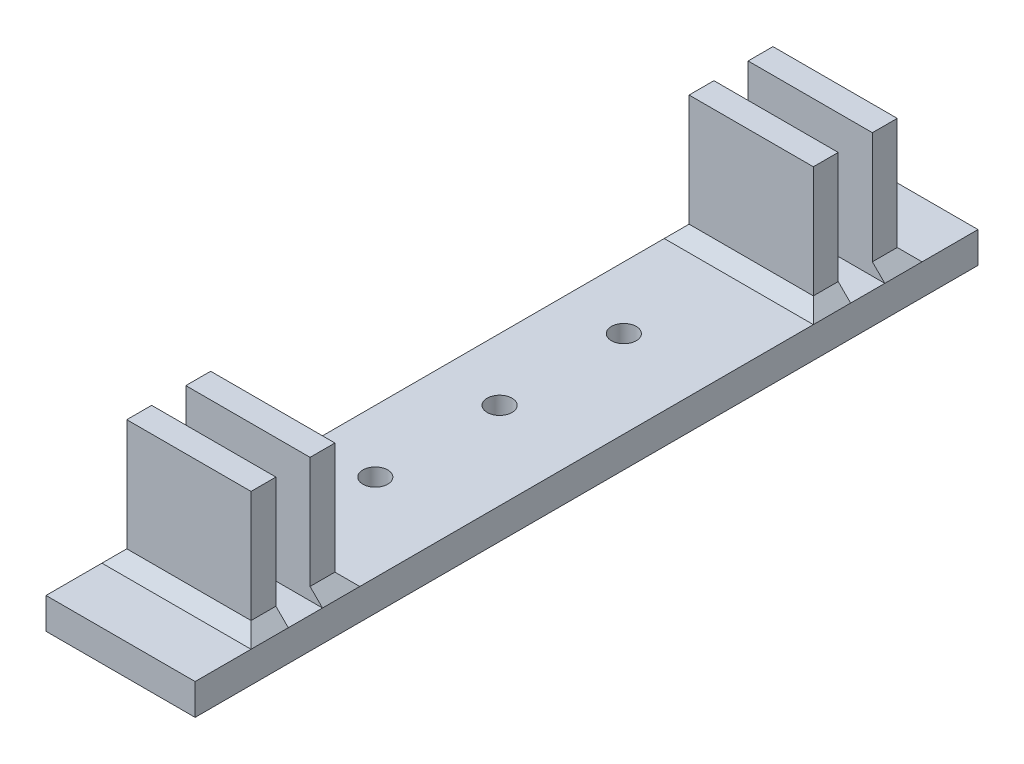
ISO-10303-21;
HEADER;
FILE_DESCRIPTION(('STEP AP214'),'2;1');
FILE_NAME('part.step','',(''),(''),'','','');
FILE_SCHEMA(('AUTOMOTIVE_DESIGN { 1 0 10303 214 1 1 1 1 }'));
ENDSEC;
DATA;
#1=APPLICATION_CONTEXT('core data for automotive mechanical design processes');
#2=APPLICATION_PROTOCOL_DEFINITION('international standard','automotive_design',2000,#1);
#3=PRODUCT_CONTEXT('',#1,'mechanical');
#4=PRODUCT('Part','Part','',(#3));
#5=PRODUCT_RELATED_PRODUCT_CATEGORY('part','',(#4));
#6=PRODUCT_DEFINITION_FORMATION('','',#4);
#7=PRODUCT_DEFINITION_CONTEXT('part definition',#1,'design');
#8=PRODUCT_DEFINITION('design','',#6,#7);
#9=PRODUCT_DEFINITION_SHAPE('','',#8);
#10=(LENGTH_UNIT() NAMED_UNIT(*) SI_UNIT(.MILLI.,.METRE.));
#11=(NAMED_UNIT(*) PLANE_ANGLE_UNIT() SI_UNIT($,.RADIAN.));
#12=(NAMED_UNIT(*) SI_UNIT($,.STERADIAN.) SOLID_ANGLE_UNIT());
#13=UNCERTAINTY_MEASURE_WITH_UNIT(LENGTH_MEASURE(1.E-05),#10,'distance_accuracy_value','');
#14=(GEOMETRIC_REPRESENTATION_CONTEXT(3) GLOBAL_UNCERTAINTY_ASSIGNED_CONTEXT((#13)) GLOBAL_UNIT_ASSIGNED_CONTEXT((#10,
#11,#12)) REPRESENTATION_CONTEXT('',''));
#15=CARTESIAN_POINT('',(0.,0.,0.));
#16=DIRECTION('',(0.,0.,1.));
#17=DIRECTION('',(1.,0.,0.));
#18=AXIS2_PLACEMENT_3D('',#15,#16,#17);
#19=CARTESIAN_POINT('',(0.,5.,0.));
#20=DIRECTION('',(0.,1.,0.));
#21=DIRECTION('',(0.,0.,1.));
#22=AXIS2_PLACEMENT_3D('',#19,#20,#21);
#23=PLANE('',#22);
#24=DIRECTION('',(1.,0.,0.));
#25=VECTOR('',#24,1.);
#26=CARTESIAN_POINT('',(-72.6508875739645,5.,74.8491124260355));
#27=LINE('',#26,#25);
#28=CARTESIAN_POINT('',(-74.6508875739645,5.,74.8491124260355));
#29=VERTEX_POINT('',#28);
#30=CARTESIAN_POINT('',(-50.6508875739645,5.,74.8491124260355));
#31=VERTEX_POINT('',#30);
#32=EDGE_CURVE('E243',#29,#31,#27,.T.);
#33=ORIENTED_EDGE('',*,*,#32,.F.);
#34=DIRECTION('',(0.,0.,1.));
#35=VECTOR('',#34,1.);
#36=CARTESIAN_POINT('',(-74.6508875739645,5.,-30.6508875739645));
#37=LINE('',#36,#35);
#38=CARTESIAN_POINT('',(-74.6508875739645,5.,80.3491124260355));
#39=VERTEX_POINT('',#38);
#40=EDGE_CURVE('E547',#29,#39,#37,.T.);
#41=ORIENTED_EDGE('',*,*,#40,.T.);
#42=DIRECTION('',(-1.,0.,0.));
#43=VECTOR('',#42,1.);
#44=CARTESIAN_POINT('',(-52.6508875739645,5.,80.3491124260355));
#45=LINE('',#44,#43);
#46=CARTESIAN_POINT('',(-50.6508875739645,5.,80.3491124260355));
#47=VERTEX_POINT('',#46);
#48=EDGE_CURVE('E248',#47,#39,#45,.T.);
#49=ORIENTED_EDGE('',*,*,#48,.F.);
#50=DIRECTION('',(0.,0.,-1.));
#51=VECTOR('',#50,1.);
#52=CARTESIAN_POINT('',(-50.6508875739645,5.,-30.6508875739645));
#53=LINE('',#52,#51);
#54=EDGE_CURVE('E889',#47,#31,#53,.T.);
#55=ORIENTED_EDGE('',*,*,#54,.T.);
#56=EDGE_LOOP('',(#33,#41,#49,#55));
#57=FACE_BOUND('',#56,.T.);
#58=ADVANCED_FACE('F32',(#57),#23,.T.);
#59=CARTESIAN_POINT('',(-64.6508875739645,5.,32.3491124260355));
#60=DIRECTION('',(0.,1.,0.));
#61=DIRECTION('',(0.,0.,1.));
#62=AXIS2_PLACEMENT_3D('',#59,#60,#61);
#63=CIRCLE('',#62,2.);
#64=CARTESIAN_POINT('',(-64.6508875739645,5.,34.3491124260355));
#65=VERTEX_POINT('',#64);
#66=EDGE_CURVE('E910',#65,#65,#63,.T.);
#67=ORIENTED_EDGE('',*,*,#66,.F.);
#68=EDGE_LOOP('',(#67));
#69=FACE_BOUND('',#68,.T.);
#70=CARTESIAN_POINT('',(-64.6508875739645,5.,12.3491124260355));
#71=DIRECTION('',(0.,1.,0.));
#72=DIRECTION('',(0.,0.,1.));
#73=AXIS2_PLACEMENT_3D('',#70,#71,#72);
#74=CIRCLE('',#73,2.);
#75=CARTESIAN_POINT('',(-64.6508875739645,5.,14.3491124260355));
#76=VERTEX_POINT('',#75);
#77=EDGE_CURVE('E907',#76,#76,#74,.T.);
#78=ORIENTED_EDGE('',*,*,#77,.F.);
#79=EDGE_LOOP('',(#78));
#80=FACE_BOUND('',#79,.T.);
#81=CARTESIAN_POINT('',(-64.6508875739645,5.,52.3491124260355));
#82=DIRECTION('',(0.,1.,0.));
#83=DIRECTION('',(0.,0.,1.));
#84=AXIS2_PLACEMENT_3D('',#81,#82,#83);
#85=CIRCLE('',#84,1.99999999999999);
#86=CARTESIAN_POINT('',(-64.6508875739645,5.,54.3491124260355));
#87=VERTEX_POINT('',#86);
#88=EDGE_CURVE('E892',#87,#87,#85,.T.);
#89=ORIENTED_EDGE('',*,*,#88,.F.);
#90=EDGE_LOOP('',(#89));
#91=FACE_BOUND('',#90,.T.);
#92=CARTESIAN_POINT('',(-74.6508875739645,5.,-4.1508875739645));
#93=VERTEX_POINT('',#92);
#94=CARTESIAN_POINT('',(-74.6508875739645,5.,68.8491124260355));
#95=VERTEX_POINT('',#94);
#96=EDGE_CURVE('E881',#93,#95,#37,.T.);
#97=ORIENTED_EDGE('',*,*,#96,.T.);
#98=DIRECTION('',(1.,0.,0.));
#99=VECTOR('',#98,1.);
#100=CARTESIAN_POINT('',(0.,5.,68.8491124260355));
#101=LINE('',#100,#99);
#102=CARTESIAN_POINT('',(-50.6508875739645,5.,68.8491124260355));
#103=VERTEX_POINT('',#102);
#104=EDGE_CURVE('E362',#95,#103,#101,.T.);
#105=ORIENTED_EDGE('',*,*,#104,.T.);
#106=CARTESIAN_POINT('',(-50.6508875739645,5.,-4.1508875739645));
#107=VERTEX_POINT('',#106);
#108=EDGE_CURVE('E450',#103,#107,#53,.T.);
#109=ORIENTED_EDGE('',*,*,#108,.T.);
#110=DIRECTION('',(-1.,0.,0.));
#111=VECTOR('',#110,1.);
#112=CARTESIAN_POINT('',(0.,5.,-4.1508875739645));
#113=LINE('',#112,#111);
#114=EDGE_CURVE('E356',#107,#93,#113,.T.);
#115=ORIENTED_EDGE('',*,*,#114,.T.);
#116=EDGE_LOOP('',(#97,#105,#109,#115));
#117=FACE_BOUND('',#116,.T.);
#118=ADVANCED_FACE('F504',(#69,#80,#91,#117),#23,.T.);
#119=DIRECTION('',(1.,0.,0.));
#120=VECTOR('',#119,1.);
#121=CARTESIAN_POINT('',(-72.6508875739645,5.,-15.6508875739645));
#122=LINE('',#121,#120);
#123=CARTESIAN_POINT('',(-74.6508875739645,5.,-15.6508875739645));
#124=VERTEX_POINT('',#123);
#125=CARTESIAN_POINT('',(-50.6508875739645,5.,-15.6508875739645));
#126=VERTEX_POINT('',#125);
#127=EDGE_CURVE('E296',#124,#126,#122,.T.);
#128=ORIENTED_EDGE('',*,*,#127,.F.);
#129=CARTESIAN_POINT('',(-74.6508875739645,5.,-10.1508875739645));
#130=VERTEX_POINT('',#129);
#131=EDGE_CURVE('E873',#124,#130,#37,.T.);
#132=ORIENTED_EDGE('',*,*,#131,.T.);
#133=DIRECTION('',(-1.,0.,0.));
#134=VECTOR('',#133,1.);
#135=CARTESIAN_POINT('',(-72.6508875739645,5.,-10.1508875739645));
#136=LINE('',#135,#134);
#137=CARTESIAN_POINT('',(-50.6508875739645,5.,-10.1508875739645));
#138=VERTEX_POINT('',#137);
#139=EDGE_CURVE('E276',#138,#130,#136,.T.);
#140=ORIENTED_EDGE('',*,*,#139,.F.);
#141=EDGE_CURVE('E441',#138,#126,#53,.T.);
#142=ORIENTED_EDGE('',*,*,#141,.T.);
#143=EDGE_LOOP('',(#128,#132,#140,#142));
#144=FACE_BOUND('',#143,.T.);
#145=ADVANCED_FACE('F511',(#144),#23,.T.);
#146=CARTESIAN_POINT('',(-74.6508875739645,5.,-30.6508875739645));
#147=VERTEX_POINT('',#146);
#148=CARTESIAN_POINT('',(-74.6508875739645,5.,-21.6508875739645));
#149=VERTEX_POINT('',#148);
#150=EDGE_CURVE('E320',#147,#149,#37,.T.);
#151=ORIENTED_EDGE('',*,*,#150,.T.);
#152=DIRECTION('',(1.,0.,0.));
#153=VECTOR('',#152,1.);
#154=CARTESIAN_POINT('',(0.,5.,-21.6508875739645));
#155=LINE('',#154,#153);
#156=CARTESIAN_POINT('',(-50.6508875739645,5.,-21.6508875739645));
#157=VERTEX_POINT('',#156);
#158=EDGE_CURVE('E358',#149,#157,#155,.T.);
#159=ORIENTED_EDGE('',*,*,#158,.T.);
#160=CARTESIAN_POINT('',(-50.6508875739645,5.,-30.6508875739645));
#161=VERTEX_POINT('',#160);
#162=EDGE_CURVE('E327',#157,#161,#53,.T.);
#163=ORIENTED_EDGE('',*,*,#162,.T.);
#164=DIRECTION('',(-1.,0.,0.));
#165=VECTOR('',#164,1.);
#166=CARTESIAN_POINT('',(-74.6508875739645,5.,-30.6508875739645));
#167=LINE('',#166,#165);
#168=EDGE_CURVE('E331',#161,#147,#167,.T.);
#169=ORIENTED_EDGE('',*,*,#168,.T.);
#170=EDGE_LOOP('',(#151,#159,#163,#169));
#171=FACE_BOUND('',#170,.T.);
#172=ADVANCED_FACE('F455',(#171),#23,.T.);
#173=CARTESIAN_POINT('',(-50.6508875739645,5.,95.3491124260355));
#174=VERTEX_POINT('',#173);
#175=CARTESIAN_POINT('',(-50.6508875739645,5.,86.3491124260355));
#176=VERTEX_POINT('',#175);
#177=EDGE_CURVE('E328',#174,#176,#53,.T.);
#178=ORIENTED_EDGE('',*,*,#177,.T.);
#179=DIRECTION('',(-1.,0.,0.));
#180=VECTOR('',#179,1.);
#181=CARTESIAN_POINT('',(0.,5.,86.3491124260355));
#182=LINE('',#181,#180);
#183=CARTESIAN_POINT('',(-74.6508875739645,5.,86.3491124260355));
#184=VERTEX_POINT('',#183);
#185=EDGE_CURVE('E360',#176,#184,#182,.T.);
#186=ORIENTED_EDGE('',*,*,#185,.T.);
#187=CARTESIAN_POINT('',(-74.6508875739645,5.,95.3491124260355));
#188=VERTEX_POINT('',#187);
#189=EDGE_CURVE('E325',#184,#188,#37,.T.);
#190=ORIENTED_EDGE('',*,*,#189,.T.);
#191=DIRECTION('',(1.,0.,0.));
#192=VECTOR('',#191,1.);
#193=CARTESIAN_POINT('',(-74.6508875739645,5.,95.3491124260355));
#194=LINE('',#193,#192);
#195=EDGE_CURVE('E323',#188,#174,#194,.T.);
#196=ORIENTED_EDGE('',*,*,#195,.T.);
#197=EDGE_LOOP('',(#178,#186,#190,#196));
#198=FACE_BOUND('',#197,.T.);
#199=ADVANCED_FACE('F507',(#198),#23,.T.);
#200=CARTESIAN_POINT('',(-74.6508875739645,5.,-30.6508875739645));
#201=DIRECTION('',(1.,0.,0.));
#202=DIRECTION('',(0.,0.,-1.));
#203=AXIS2_PLACEMENT_3D('',#200,#201,#202);
#204=PLANE('',#203);
#205=DIRECTION('',(0.,0.,1.));
#206=VECTOR('',#205,1.);
#207=CARTESIAN_POINT('',(-74.6508875739645,0.,-30.6508875739645));
#208=LINE('',#207,#206);
#209=CARTESIAN_POINT('',(-74.6508875739645,0.,-30.6508875739645));
#210=VERTEX_POINT('',#209);
#211=CARTESIAN_POINT('',(-74.6508875739645,0.,95.3491124260355));
#212=VERTEX_POINT('',#211);
#213=EDGE_CURVE('E319',#210,#212,#208,.T.);
#214=ORIENTED_EDGE('',*,*,#213,.T.);
#215=DIRECTION('',(0.,-1.,0.));
#216=VECTOR('',#215,1.);
#217=CARTESIAN_POINT('',(-74.6508875739645,5.,95.3491124260355));
#218=LINE('',#217,#216);
#219=EDGE_CURVE('E351',#188,#212,#218,.T.);
#220=ORIENTED_EDGE('',*,*,#219,.F.);
#221=ORIENTED_EDGE('',*,*,#189,.F.);
#222=EDGE_CURVE('E544',#39,#184,#37,.T.);
#223=ORIENTED_EDGE('',*,*,#222,.F.);
#224=ORIENTED_EDGE('',*,*,#40,.F.);
#225=EDGE_CURVE('E548',#95,#29,#37,.T.);
#226=ORIENTED_EDGE('',*,*,#225,.F.);
#227=ORIENTED_EDGE('',*,*,#96,.F.);
#228=EDGE_CURVE('E875',#130,#93,#37,.T.);
#229=ORIENTED_EDGE('',*,*,#228,.F.);
#230=ORIENTED_EDGE('',*,*,#131,.F.);
#231=EDGE_CURVE('E324',#149,#124,#37,.T.);
#232=ORIENTED_EDGE('',*,*,#231,.F.);
#233=ORIENTED_EDGE('',*,*,#150,.F.);
#234=DIRECTION('',(0.,-1.,0.));
#235=VECTOR('',#234,1.);
#236=CARTESIAN_POINT('',(-74.6508875739645,5.,-30.6508875739645));
#237=LINE('',#236,#235);
#238=EDGE_CURVE('E334',#147,#210,#237,.T.);
#239=ORIENTED_EDGE('',*,*,#238,.T.);
#240=EDGE_LOOP('',(#214,#220,#221,#223,#224,#226,#227,#229,#230,#232,#233,#239));
#241=FACE_BOUND('',#240,.T.);
#242=ADVANCED_FACE('F466',(#241),#204,.F.);
#243=CARTESIAN_POINT('',(-74.6508875739645,5.,95.3491124260355));
#244=DIRECTION('',(0.,0.,-1.));
#245=DIRECTION('',(-1.,0.,0.));
#246=AXIS2_PLACEMENT_3D('',#243,#244,#245);
#247=PLANE('',#246);
#248=DIRECTION('',(1.,0.,0.));
#249=VECTOR('',#248,1.);
#250=CARTESIAN_POINT('',(-74.6508875739645,0.,95.3491124260355));
#251=LINE('',#250,#249);
#252=CARTESIAN_POINT('',(-50.6508875739645,0.,95.3491124260355));
#253=VERTEX_POINT('',#252);
#254=EDGE_CURVE('E337',#212,#253,#251,.T.);
#255=ORIENTED_EDGE('',*,*,#254,.T.);
#256=DIRECTION('',(0.,-1.,0.));
#257=VECTOR('',#256,1.);
#258=CARTESIAN_POINT('',(-50.6508875739645,5.,95.3491124260355));
#259=LINE('',#258,#257);
#260=EDGE_CURVE('E348',#174,#253,#259,.T.);
#261=ORIENTED_EDGE('',*,*,#260,.F.);
#262=ORIENTED_EDGE('',*,*,#195,.F.);
#263=ORIENTED_EDGE('',*,*,#219,.T.);
#264=EDGE_LOOP('',(#255,#261,#262,#263));
#265=FACE_BOUND('',#264,.T.);
#266=ADVANCED_FACE('F521',(#265),#247,.F.);
#267=CARTESIAN_POINT('',(-50.6508875739645,5.,-30.6508875739645));
#268=DIRECTION('',(-1.,0.,0.));
#269=DIRECTION('',(0.,0.,1.));
#270=AXIS2_PLACEMENT_3D('',#267,#268,#269);
#271=PLANE('',#270);
#272=DIRECTION('',(0.,0.,-1.));
#273=VECTOR('',#272,1.);
#274=CARTESIAN_POINT('',(-50.6508875739645,0.,-30.6508875739645));
#275=LINE('',#274,#273);
#276=CARTESIAN_POINT('',(-50.6508875739645,0.,-30.6508875739645));
#277=VERTEX_POINT('',#276);
#278=EDGE_CURVE('E339',#253,#277,#275,.T.);
#279=ORIENTED_EDGE('',*,*,#278,.T.);
#280=DIRECTION('',(0.,-1.,0.));
#281=VECTOR('',#280,1.);
#282=CARTESIAN_POINT('',(-50.6508875739645,5.,-30.6508875739645));
#283=LINE('',#282,#281);
#284=EDGE_CURVE('E345',#161,#277,#283,.T.);
#285=ORIENTED_EDGE('',*,*,#284,.F.);
#286=ORIENTED_EDGE('',*,*,#162,.F.);
#287=EDGE_CURVE('E447',#126,#157,#53,.T.);
#288=ORIENTED_EDGE('',*,*,#287,.F.);
#289=ORIENTED_EDGE('',*,*,#141,.F.);
#290=EDGE_CURVE('E432',#107,#138,#53,.T.);
#291=ORIENTED_EDGE('',*,*,#290,.F.);
#292=ORIENTED_EDGE('',*,*,#108,.F.);
#293=EDGE_CURVE('E903',#31,#103,#53,.T.);
#294=ORIENTED_EDGE('',*,*,#293,.F.);
#295=ORIENTED_EDGE('',*,*,#54,.F.);
#296=EDGE_CURVE('E332',#176,#47,#53,.T.);
#297=ORIENTED_EDGE('',*,*,#296,.F.);
#298=ORIENTED_EDGE('',*,*,#177,.F.);
#299=ORIENTED_EDGE('',*,*,#260,.T.);
#300=EDGE_LOOP('',(#279,#285,#286,#288,#289,#291,#292,#294,#295,#297,#298,#299));
#301=FACE_BOUND('',#300,.T.);
#302=ADVANCED_FACE('F442',(#301),#271,.F.);
#303=CARTESIAN_POINT('',(-74.6508875739645,5.,-30.6508875739645));
#304=DIRECTION('',(0.,0.,1.));
#305=DIRECTION('',(1.,0.,0.));
#306=AXIS2_PLACEMENT_3D('',#303,#304,#305);
#307=PLANE('',#306);
#308=DIRECTION('',(-1.,0.,0.));
#309=VECTOR('',#308,1.);
#310=CARTESIAN_POINT('',(-74.6508875739645,0.,-30.6508875739645));
#311=LINE('',#310,#309);
#312=EDGE_CURVE('E341',#277,#210,#311,.T.);
#313=ORIENTED_EDGE('',*,*,#312,.T.);
#314=ORIENTED_EDGE('',*,*,#238,.F.);
#315=ORIENTED_EDGE('',*,*,#168,.F.);
#316=ORIENTED_EDGE('',*,*,#284,.T.);
#317=EDGE_LOOP('',(#313,#314,#315,#316));
#318=FACE_BOUND('',#317,.T.);
#319=ADVANCED_FACE('F462',(#318),#307,.F.);
#320=CARTESIAN_POINT('',(0.,0.,0.));
#321=DIRECTION('',(0.,1.,0.));
#322=DIRECTION('',(0.,0.,1.));
#323=AXIS2_PLACEMENT_3D('',#320,#321,#322);
#324=PLANE('',#323);
#325=CARTESIAN_POINT('',(-64.6508875739645,0.,52.3491124260355));
#326=DIRECTION('',(0.,1.,0.));
#327=DIRECTION('',(0.,0.,-1.));
#328=AXIS2_PLACEMENT_3D('',#325,#326,#327);
#329=CIRCLE('',#328,1.99999999999999);
#330=CARTESIAN_POINT('',(-64.6508875739645,0.,50.3491124260355));
#331=VERTEX_POINT('',#330);
#332=EDGE_CURVE('E409',#331,#331,#329,.T.);
#333=ORIENTED_EDGE('',*,*,#332,.T.);
#334=EDGE_LOOP('',(#333));
#335=FACE_BOUND('',#334,.T.);
#336=CARTESIAN_POINT('',(-64.6508875739645,0.,12.3491124260355));
#337=DIRECTION('',(0.,1.,0.));
#338=DIRECTION('',(0.,0.,1.));
#339=AXIS2_PLACEMENT_3D('',#336,#337,#338);
#340=CIRCLE('',#339,2.);
#341=CARTESIAN_POINT('',(-64.6508875739645,0.,14.3491124260355));
#342=VERTEX_POINT('',#341);
#343=EDGE_CURVE('E916',#342,#342,#340,.T.);
#344=ORIENTED_EDGE('',*,*,#343,.T.);
#345=EDGE_LOOP('',(#344));
#346=FACE_BOUND('',#345,.T.);
#347=CARTESIAN_POINT('',(-64.6508875739645,0.,32.3491124260355));
#348=DIRECTION('',(0.,1.,0.));
#349=DIRECTION('',(0.,0.,1.));
#350=AXIS2_PLACEMENT_3D('',#347,#348,#349);
#351=CIRCLE('',#350,2.);
#352=CARTESIAN_POINT('',(-64.6508875739645,0.,34.3491124260355));
#353=VERTEX_POINT('',#352);
#354=EDGE_CURVE('E913',#353,#353,#351,.T.);
#355=ORIENTED_EDGE('',*,*,#354,.T.);
#356=EDGE_LOOP('',(#355));
#357=FACE_BOUND('',#356,.T.);
#358=ORIENTED_EDGE('',*,*,#213,.F.);
#359=ORIENTED_EDGE('',*,*,#312,.F.);
#360=ORIENTED_EDGE('',*,*,#278,.F.);
#361=ORIENTED_EDGE('',*,*,#254,.F.);
#362=EDGE_LOOP('',(#358,#359,#360,#361));
#363=FACE_BOUND('',#362,.T.);
#364=ADVANCED_FACE('F552',(#335,#346,#357,#363),#324,.F.);
#365=CARTESIAN_POINT('',(-72.6508875739645,25.,-15.6508875739645));
#366=DIRECTION('',(1.,0.,0.));
#367=DIRECTION('',(0.,0.,-1.));
#368=AXIS2_PLACEMENT_3D('',#365,#366,#367);
#369=PLANE('',#368);
#370=DIRECTION('',(0.,-1.,0.));
#371=VECTOR('',#370,1.);
#372=CARTESIAN_POINT('',(-72.6508875739645,25.,-19.6508875739645));
#373=LINE('',#372,#371);
#374=CARTESIAN_POINT('',(-72.6508875739645,25.,-19.6508875739645));
#375=VERTEX_POINT('',#374);
#376=CARTESIAN_POINT('',(-72.6508875739645,7.00000000000003,-19.6508875739645));
#377=VERTEX_POINT('',#376);
#378=EDGE_CURVE('E306',#375,#377,#373,.T.);
#379=ORIENTED_EDGE('',*,*,#378,.T.);
#380=DIRECTION('',(0.,0.,1.));
#381=VECTOR('',#380,1.);
#382=CARTESIAN_POINT('',(-72.6508875739645,7.00000000000003,-15.6508875739645));
#383=LINE('',#382,#381);
#384=CARTESIAN_POINT('',(-72.6508875739645,7.00000000000003,-15.6508875739645));
#385=VERTEX_POINT('',#384);
#386=EDGE_CURVE('E374',#377,#385,#383,.T.);
#387=ORIENTED_EDGE('',*,*,#386,.T.);
#388=DIRECTION('',(0.,-1.,0.));
#389=VECTOR('',#388,1.);
#390=CARTESIAN_POINT('',(-72.6508875739645,25.,-15.6508875739645));
#391=LINE('',#390,#389);
#392=CARTESIAN_POINT('',(-72.6508875739645,25.,-15.6508875739645));
#393=VERTEX_POINT('',#392);
#394=EDGE_CURVE('E316',#393,#385,#391,.T.);
#395=ORIENTED_EDGE('',*,*,#394,.F.);
#396=DIRECTION('',(0.,0.,1.));
#397=VECTOR('',#396,1.);
#398=CARTESIAN_POINT('',(-72.6508875739645,25.,-15.6508875739645));
#399=LINE('',#398,#397);
#400=EDGE_CURVE('E297',#375,#393,#399,.T.);
#401=ORIENTED_EDGE('',*,*,#400,.F.);
#402=EDGE_LOOP('',(#379,#387,#395,#401));
#403=FACE_BOUND('',#402,.T.);
#404=ADVANCED_FACE('F478',(#403),#369,.F.);
#405=CARTESIAN_POINT('',(-72.6508875739645,25.,-15.6508875739645));
#406=DIRECTION('',(0.,0.,-1.));
#407=DIRECTION('',(-1.,0.,0.));
#408=AXIS2_PLACEMENT_3D('',#405,#406,#407);
#409=PLANE('',#408);
#410=ORIENTED_EDGE('',*,*,#127,.T.);
#411=DIRECTION('',(-0.707106781186544,0.707106781186551,0.));
#412=VECTOR('',#411,1.);
#413=CARTESIAN_POINT('',(-71.6508875739644,26.0000000000001,-15.6508875739645));
#414=LINE('',#413,#412);
#415=CARTESIAN_POINT('',(-52.6508875739645,7.00000000000003,-15.6508875739645));
#416=VERTEX_POINT('',#415);
#417=EDGE_CURVE('E399',#126,#416,#414,.T.);
#418=ORIENTED_EDGE('',*,*,#417,.T.);
#419=DIRECTION('',(0.,-1.,0.));
#420=VECTOR('',#419,1.);
#421=CARTESIAN_POINT('',(-52.6508875739645,25.,-15.6508875739645));
#422=LINE('',#421,#420);
#423=CARTESIAN_POINT('',(-52.6508875739645,25.,-15.6508875739645));
#424=VERTEX_POINT('',#423);
#425=EDGE_CURVE('E313',#424,#416,#422,.T.);
#426=ORIENTED_EDGE('',*,*,#425,.F.);
#427=DIRECTION('',(1.,0.,0.));
#428=VECTOR('',#427,1.);
#429=CARTESIAN_POINT('',(-72.6508875739645,25.,-15.6508875739645));
#430=LINE('',#429,#428);
#431=EDGE_CURVE('E300',#393,#424,#430,.T.);
#432=ORIENTED_EDGE('',*,*,#431,.F.);
#433=ORIENTED_EDGE('',*,*,#394,.T.);
#434=DIRECTION('',(-0.707106781186542,-0.707106781186553,0.));
#435=VECTOR('',#434,1.);
#436=CARTESIAN_POINT('',(-63.6508875739645,16.0000000000001,-15.6508875739645));
#437=LINE('',#436,#435);
#438=EDGE_CURVE('E396',#385,#124,#437,.T.);
#439=ORIENTED_EDGE('',*,*,#438,.T.);
#440=EDGE_LOOP('',(#410,#418,#426,#432,#433,#439));
#441=FACE_BOUND('',#440,.T.);
#442=ADVANCED_FACE('F482',(#441),#409,.F.);
#443=CARTESIAN_POINT('',(-52.6508875739645,25.,-15.6508875739645));
#444=DIRECTION('',(-1.,0.,0.));
#445=DIRECTION('',(0.,0.,1.));
#446=AXIS2_PLACEMENT_3D('',#443,#444,#445);
#447=PLANE('',#446);
#448=ORIENTED_EDGE('',*,*,#425,.T.);
#449=DIRECTION('',(0.,0.,-1.));
#450=VECTOR('',#449,1.);
#451=CARTESIAN_POINT('',(-52.6508875739645,7.00000000000003,-15.6508875739645));
#452=LINE('',#451,#450);
#453=CARTESIAN_POINT('',(-52.6508875739645,7.00000000000003,-19.6508875739645));
#454=VERTEX_POINT('',#453);
#455=EDGE_CURVE('E379',#416,#454,#452,.T.);
#456=ORIENTED_EDGE('',*,*,#455,.T.);
#457=DIRECTION('',(0.,-1.,0.));
#458=VECTOR('',#457,1.);
#459=CARTESIAN_POINT('',(-52.6508875739645,25.,-19.6508875739645));
#460=LINE('',#459,#458);
#461=CARTESIAN_POINT('',(-52.6508875739645,25.,-19.6508875739645));
#462=VERTEX_POINT('',#461);
#463=EDGE_CURVE('E310',#462,#454,#460,.T.);
#464=ORIENTED_EDGE('',*,*,#463,.F.);
#465=DIRECTION('',(0.,0.,-1.));
#466=VECTOR('',#465,1.);
#467=CARTESIAN_POINT('',(-52.6508875739645,25.,-15.6508875739645));
#468=LINE('',#467,#466);
#469=EDGE_CURVE('E302',#424,#462,#468,.T.);
#470=ORIENTED_EDGE('',*,*,#469,.F.);
#471=EDGE_LOOP('',(#448,#456,#464,#470));
#472=FACE_BOUND('',#471,.T.);
#473=ADVANCED_FACE('F494',(#472),#447,.F.);
#474=CARTESIAN_POINT('',(-72.6508875739645,25.,-19.6508875739645));
#475=DIRECTION('',(0.,0.,1.));
#476=DIRECTION('',(1.,0.,0.));
#477=AXIS2_PLACEMENT_3D('',#474,#475,#476);
#478=PLANE('',#477);
#479=ORIENTED_EDGE('',*,*,#463,.T.);
#480=DIRECTION('',(-1.,0.,0.));
#481=VECTOR('',#480,1.);
#482=CARTESIAN_POINT('',(-72.6508875739645,7.00000000000003,-19.6508875739645));
#483=LINE('',#482,#481);
#484=EDGE_CURVE('E377',#454,#377,#483,.T.);
#485=ORIENTED_EDGE('',*,*,#484,.T.);
#486=ORIENTED_EDGE('',*,*,#378,.F.);
#487=DIRECTION('',(-1.,0.,0.));
#488=VECTOR('',#487,1.);
#489=CARTESIAN_POINT('',(-72.6508875739645,25.,-19.6508875739645));
#490=LINE('',#489,#488);
#491=EDGE_CURVE('E304',#462,#375,#490,.T.);
#492=ORIENTED_EDGE('',*,*,#491,.F.);
#493=EDGE_LOOP('',(#479,#485,#486,#492));
#494=FACE_BOUND('',#493,.T.);
#495=ADVANCED_FACE('F490',(#494),#478,.F.);
#496=CARTESIAN_POINT('',(0.,25.,0.));
#497=DIRECTION('',(0.,-1.,0.));
#498=DIRECTION('',(0.,0.,-1.));
#499=AXIS2_PLACEMENT_3D('',#496,#497,#498);
#500=PLANE('',#499);
#501=ORIENTED_EDGE('',*,*,#400,.T.);
#502=ORIENTED_EDGE('',*,*,#431,.T.);
#503=ORIENTED_EDGE('',*,*,#469,.T.);
#504=ORIENTED_EDGE('',*,*,#491,.T.);
#505=EDGE_LOOP('',(#501,#502,#503,#504));
#506=FACE_BOUND('',#505,.T.);
#507=ADVANCED_FACE('F486',(#506),#500,.F.);
#508=CARTESIAN_POINT('',(-72.6508875739645,25.,-6.1508875739645));
#509=DIRECTION('',(1.,0.,0.));
#510=DIRECTION('',(0.,0.,-1.));
#511=AXIS2_PLACEMENT_3D('',#508,#509,#510);
#512=PLANE('',#511);
#513=DIRECTION('',(0.,-1.,0.));
#514=VECTOR('',#513,1.);
#515=CARTESIAN_POINT('',(-72.6508875739645,25.,-10.1508875739645));
#516=LINE('',#515,#514);
#517=CARTESIAN_POINT('',(-72.6508875739645,25.,-10.1508875739645));
#518=VERTEX_POINT('',#517);
#519=CARTESIAN_POINT('',(-72.6508875739645,7.00000000000003,-10.1508875739645));
#520=VERTEX_POINT('',#519);
#521=EDGE_CURVE('E286',#518,#520,#516,.T.);
#522=ORIENTED_EDGE('',*,*,#521,.T.);
#523=DIRECTION('',(0.,0.,1.));
#524=VECTOR('',#523,1.);
#525=CARTESIAN_POINT('',(-72.6508875739645,7.00000000000003,-6.1508875739645));
#526=LINE('',#525,#524);
#527=CARTESIAN_POINT('',(-72.6508875739645,7.00000000000003,-6.1508875739645));
#528=VERTEX_POINT('',#527);
#529=EDGE_CURVE('E381',#520,#528,#526,.T.);
#530=ORIENTED_EDGE('',*,*,#529,.T.);
#531=DIRECTION('',(0.,-1.,0.));
#532=VECTOR('',#531,1.);
#533=CARTESIAN_POINT('',(-72.6508875739645,25.,-6.1508875739645));
#534=LINE('',#533,#532);
#535=CARTESIAN_POINT('',(-72.6508875739645,25.,-6.1508875739645));
#536=VERTEX_POINT('',#535);
#537=EDGE_CURVE('E294',#536,#528,#534,.T.);
#538=ORIENTED_EDGE('',*,*,#537,.F.);
#539=DIRECTION('',(0.,0.,1.));
#540=VECTOR('',#539,1.);
#541=CARTESIAN_POINT('',(-72.6508875739645,25.,-6.1508875739645));
#542=LINE('',#541,#540);
#543=EDGE_CURVE('E277',#518,#536,#542,.T.);
#544=ORIENTED_EDGE('',*,*,#543,.F.);
#545=EDGE_LOOP('',(#522,#530,#538,#544));
#546=FACE_BOUND('',#545,.T.);
#547=ADVANCED_FACE('F762',(#546),#512,.F.);
#548=CARTESIAN_POINT('',(-72.6508875739645,25.,-6.1508875739645));
#549=DIRECTION('',(0.,0.,-1.));
#550=DIRECTION('',(-1.,0.,0.));
#551=AXIS2_PLACEMENT_3D('',#548,#549,#550);
#552=PLANE('',#551);
#553=ORIENTED_EDGE('',*,*,#537,.T.);
#554=DIRECTION('',(1.,0.,0.));
#555=VECTOR('',#554,1.);
#556=CARTESIAN_POINT('',(-72.6508875739645,7.00000000000003,-6.1508875739645));
#557=LINE('',#556,#555);
#558=CARTESIAN_POINT('',(-52.6508875739645,7.00000000000003,-6.1508875739645));
#559=VERTEX_POINT('',#558);
#560=EDGE_CURVE('E57',#528,#559,#557,.T.);
#561=ORIENTED_EDGE('',*,*,#560,.T.);
#562=DIRECTION('',(0.,-1.,0.));
#563=VECTOR('',#562,1.);
#564=CARTESIAN_POINT('',(-52.6508875739645,25.,-6.1508875739645));
#565=LINE('',#564,#563);
#566=CARTESIAN_POINT('',(-52.6508875739645,25.,-6.1508875739645));
#567=VERTEX_POINT('',#566);
#568=EDGE_CURVE('E292',#567,#559,#565,.T.);
#569=ORIENTED_EDGE('',*,*,#568,.F.);
#570=DIRECTION('',(1.,0.,0.));
#571=VECTOR('',#570,1.);
#572=CARTESIAN_POINT('',(-72.6508875739645,25.,-6.1508875739645));
#573=LINE('',#572,#571);
#574=EDGE_CURVE('E280',#536,#567,#573,.T.);
#575=ORIENTED_EDGE('',*,*,#574,.F.);
#576=EDGE_LOOP('',(#553,#561,#569,#575));
#577=FACE_BOUND('',#576,.T.);
#578=ADVANCED_FACE('F755',(#577),#552,.F.);
#579=CARTESIAN_POINT('',(-52.6508875739645,25.,-6.1508875739645));
#580=DIRECTION('',(-1.,0.,0.));
#581=DIRECTION('',(0.,0.,1.));
#582=AXIS2_PLACEMENT_3D('',#579,#580,#581);
#583=PLANE('',#582);
#584=ORIENTED_EDGE('',*,*,#568,.T.);
#585=DIRECTION('',(0.,0.,-1.));
#586=VECTOR('',#585,1.);
#587=CARTESIAN_POINT('',(-52.6508875739645,7.00000000000003,-6.1508875739645));
#588=LINE('',#587,#586);
#589=CARTESIAN_POINT('',(-52.6508875739645,7.00000000000003,-10.1508875739645));
#590=VERTEX_POINT('',#589);
#591=EDGE_CURVE('E49',#559,#590,#588,.T.);
#592=ORIENTED_EDGE('',*,*,#591,.T.);
#593=DIRECTION('',(0.,-1.,0.));
#594=VECTOR('',#593,1.);
#595=CARTESIAN_POINT('',(-52.6508875739645,25.,-10.1508875739645));
#596=LINE('',#595,#594);
#597=CARTESIAN_POINT('',(-52.6508875739645,25.,-10.1508875739645));
#598=VERTEX_POINT('',#597);
#599=EDGE_CURVE('E290',#598,#590,#596,.T.);
#600=ORIENTED_EDGE('',*,*,#599,.F.);
#601=DIRECTION('',(0.,0.,-1.));
#602=VECTOR('',#601,1.);
#603=CARTESIAN_POINT('',(-52.6508875739645,25.,-6.1508875739645));
#604=LINE('',#603,#602);
#605=EDGE_CURVE('E282',#567,#598,#604,.T.);
#606=ORIENTED_EDGE('',*,*,#605,.F.);
#607=EDGE_LOOP('',(#584,#592,#600,#606));
#608=FACE_BOUND('',#607,.T.);
#609=ADVANCED_FACE('F748',(#608),#583,.F.);
#610=CARTESIAN_POINT('',(-72.6508875739645,25.,-10.1508875739645));
#611=DIRECTION('',(0.,0.,1.));
#612=DIRECTION('',(1.,0.,0.));
#613=AXIS2_PLACEMENT_3D('',#610,#611,#612);
#614=PLANE('',#613);
#615=ORIENTED_EDGE('',*,*,#139,.T.);
#616=DIRECTION('',(0.707106781186542,0.707106781186553,0.));
#617=VECTOR('',#616,1.);
#618=CARTESIAN_POINT('',(-63.6508875739645,16.0000000000001,-10.1508875739645));
#619=LINE('',#618,#617);
#620=EDGE_CURVE('E41',#130,#520,#619,.T.);
#621=ORIENTED_EDGE('',*,*,#620,.T.);
#622=ORIENTED_EDGE('',*,*,#521,.F.);
#623=DIRECTION('',(-1.,0.,0.));
#624=VECTOR('',#623,1.);
#625=CARTESIAN_POINT('',(-72.6508875739645,25.,-10.1508875739645));
#626=LINE('',#625,#624);
#627=EDGE_CURVE('E284',#598,#518,#626,.T.);
#628=ORIENTED_EDGE('',*,*,#627,.F.);
#629=ORIENTED_EDGE('',*,*,#599,.T.);
#630=DIRECTION('',(0.707106781186542,-0.707106781186553,0.));
#631=VECTOR('',#630,1.);
#632=CARTESIAN_POINT('',(-71.6508875739643,26.0000000000001,-10.1508875739645));
#633=LINE('',#632,#631);
#634=EDGE_CURVE('E11',#590,#138,#633,.T.);
#635=ORIENTED_EDGE('',*,*,#634,.T.);
#636=EDGE_LOOP('',(#615,#621,#622,#628,#629,#635));
#637=FACE_BOUND('',#636,.T.);
#638=ADVANCED_FACE('F435',(#637),#614,.F.);
#639=CARTESIAN_POINT('',(0.,25.,0.));
#640=DIRECTION('',(0.,-1.,0.));
#641=DIRECTION('',(0.,0.,-1.));
#642=AXIS2_PLACEMENT_3D('',#639,#640,#641);
#643=PLANE('',#642);
#644=ORIENTED_EDGE('',*,*,#543,.T.);
#645=ORIENTED_EDGE('',*,*,#574,.T.);
#646=ORIENTED_EDGE('',*,*,#605,.T.);
#647=ORIENTED_EDGE('',*,*,#627,.T.);
#648=EDGE_LOOP('',(#644,#645,#646,#647));
#649=FACE_BOUND('',#648,.T.);
#650=ADVANCED_FACE('F733',(#649),#643,.F.);
#651=CARTESIAN_POINT('',(-52.6508875739645,25.,80.3491124260355));
#652=DIRECTION('',(0.,0.,1.));
#653=DIRECTION('',(1.,0.,0.));
#654=AXIS2_PLACEMENT_3D('',#651,#652,#653);
#655=PLANE('',#654);
#656=ORIENTED_EDGE('',*,*,#48,.T.);
#657=DIRECTION('',(0.707106781186542,0.707106781186553,0.));
#658=VECTOR('',#657,1.);
#659=CARTESIAN_POINT('',(-53.6508875739646,26.0000000000001,80.3491124260355));
#660=LINE('',#659,#658);
#661=CARTESIAN_POINT('',(-72.6508875739645,7.00000000000003,80.3491124260355));
#662=VERTEX_POINT('',#661);
#663=EDGE_CURVE('E391',#39,#662,#660,.T.);
#664=ORIENTED_EDGE('',*,*,#663,.T.);
#665=DIRECTION('',(0.,-1.,0.));
#666=VECTOR('',#665,1.);
#667=CARTESIAN_POINT('',(-72.6508875739645,25.,80.3491124260355));
#668=LINE('',#667,#666);
#669=CARTESIAN_POINT('',(-72.6508875739645,25.,80.3491124260355));
#670=VERTEX_POINT('',#669);
#671=EDGE_CURVE('E273',#670,#662,#668,.T.);
#672=ORIENTED_EDGE('',*,*,#671,.F.);
#673=DIRECTION('',(-1.,0.,0.));
#674=VECTOR('',#673,1.);
#675=CARTESIAN_POINT('',(-52.6508875739645,25.,80.3491124260355));
#676=LINE('',#675,#674);
#677=CARTESIAN_POINT('',(-52.6508875739645,25.,80.3491124260355));
#678=VERTEX_POINT('',#677);
#679=EDGE_CURVE('E250',#678,#670,#676,.T.);
#680=ORIENTED_EDGE('',*,*,#679,.F.);
#681=DIRECTION('',(0.,-1.,0.));
#682=VECTOR('',#681,1.);
#683=CARTESIAN_POINT('',(-52.6508875739645,25.,80.3491124260355));
#684=LINE('',#683,#682);
#685=CARTESIAN_POINT('',(-52.6508875739645,7.00000000000003,80.3491124260355));
#686=VERTEX_POINT('',#685);
#687=EDGE_CURVE('E263',#678,#686,#684,.T.);
#688=ORIENTED_EDGE('',*,*,#687,.T.);
#689=DIRECTION('',(0.707106781186541,-0.707106781186554,0.));
#690=VECTOR('',#689,1.);
#691=CARTESIAN_POINT('',(-61.6508875739645,16.0000000000002,80.3491124260355));
#692=LINE('',#691,#690);
#693=EDGE_CURVE('E393',#686,#47,#692,.T.);
#694=ORIENTED_EDGE('',*,*,#693,.T.);
#695=EDGE_LOOP('',(#656,#664,#672,#680,#688,#694));
#696=FACE_BOUND('',#695,.T.);
#697=ADVANCED_FACE('F725',(#696),#655,.F.);
#698=CARTESIAN_POINT('',(-72.6508875739645,25.,80.3491124260355));
#699=DIRECTION('',(1.,0.,0.));
#700=DIRECTION('',(0.,0.,-1.));
#701=AXIS2_PLACEMENT_3D('',#698,#699,#700);
#702=PLANE('',#701);
#703=ORIENTED_EDGE('',*,*,#671,.T.);
#704=DIRECTION('',(0.,0.,1.));
#705=VECTOR('',#704,1.);
#706=CARTESIAN_POINT('',(-72.6508875739645,7.00000000000003,80.3491124260355));
#707=LINE('',#706,#705);
#708=CARTESIAN_POINT('',(-72.6508875739645,7.00000000000003,84.3491124260355));
#709=VERTEX_POINT('',#708);
#710=EDGE_CURVE('E367',#662,#709,#707,.T.);
#711=ORIENTED_EDGE('',*,*,#710,.T.);
#712=DIRECTION('',(0.,-1.,0.));
#713=VECTOR('',#712,1.);
#714=CARTESIAN_POINT('',(-72.6508875739645,25.,84.3491124260355));
#715=LINE('',#714,#713);
#716=CARTESIAN_POINT('',(-72.6508875739645,25.,84.3491124260355));
#717=VERTEX_POINT('',#716);
#718=EDGE_CURVE('E270',#717,#709,#715,.T.);
#719=ORIENTED_EDGE('',*,*,#718,.F.);
#720=DIRECTION('',(0.,0.,1.));
#721=VECTOR('',#720,1.);
#722=CARTESIAN_POINT('',(-72.6508875739645,25.,80.3491124260355));
#723=LINE('',#722,#721);
#724=EDGE_CURVE('E258',#670,#717,#723,.T.);
#725=ORIENTED_EDGE('',*,*,#724,.F.);
#726=EDGE_LOOP('',(#703,#711,#719,#725));
#727=FACE_BOUND('',#726,.T.);
#728=ADVANCED_FACE('F717',(#727),#702,.F.);
#729=CARTESIAN_POINT('',(-72.6508875739645,25.,84.3491124260355));
#730=DIRECTION('',(0.,0.,-1.));
#731=DIRECTION('',(-1.,0.,0.));
#732=AXIS2_PLACEMENT_3D('',#729,#730,#731);
#733=PLANE('',#732);
#734=ORIENTED_EDGE('',*,*,#718,.T.);
#735=DIRECTION('',(1.,0.,0.));
#736=VECTOR('',#735,1.);
#737=CARTESIAN_POINT('',(-72.6508875739645,7.00000000000003,84.3491124260355));
#738=LINE('',#737,#736);
#739=CARTESIAN_POINT('',(-52.6508875739645,7.00000000000003,84.3491124260355));
#740=VERTEX_POINT('',#739);
#741=EDGE_CURVE('E370',#709,#740,#738,.T.);
#742=ORIENTED_EDGE('',*,*,#741,.T.);
#743=DIRECTION('',(0.,-1.,0.));
#744=VECTOR('',#743,1.);
#745=CARTESIAN_POINT('',(-52.6508875739645,25.,84.3491124260355));
#746=LINE('',#745,#744);
#747=CARTESIAN_POINT('',(-52.6508875739645,25.,84.3491124260355));
#748=VERTEX_POINT('',#747);
#749=EDGE_CURVE('E267',#748,#740,#746,.T.);
#750=ORIENTED_EDGE('',*,*,#749,.F.);
#751=DIRECTION('',(1.,0.,0.));
#752=VECTOR('',#751,1.);
#753=CARTESIAN_POINT('',(-72.6508875739645,25.,84.3491124260355));
#754=LINE('',#753,#752);
#755=EDGE_CURVE('E260',#717,#748,#754,.T.);
#756=ORIENTED_EDGE('',*,*,#755,.F.);
#757=EDGE_LOOP('',(#734,#742,#750,#756));
#758=FACE_BOUND('',#757,.T.);
#759=ADVANCED_FACE('F709',(#758),#733,.F.);
#760=CARTESIAN_POINT('',(-52.6508875739645,25.,80.3491124260355));
#761=DIRECTION('',(-1.,0.,0.));
#762=DIRECTION('',(0.,0.,1.));
#763=AXIS2_PLACEMENT_3D('',#760,#761,#762);
#764=PLANE('',#763);
#765=ORIENTED_EDGE('',*,*,#749,.T.);
#766=DIRECTION('',(0.,0.,-1.));
#767=VECTOR('',#766,1.);
#768=CARTESIAN_POINT('',(-52.6508875739645,7.00000000000003,80.3491124260355));
#769=LINE('',#768,#767);
#770=EDGE_CURVE('E372',#740,#686,#769,.T.);
#771=ORIENTED_EDGE('',*,*,#770,.T.);
#772=ORIENTED_EDGE('',*,*,#687,.F.);
#773=DIRECTION('',(0.,0.,-1.));
#774=VECTOR('',#773,1.);
#775=CARTESIAN_POINT('',(-52.6508875739645,25.,80.3491124260355));
#776=LINE('',#775,#774);
#777=EDGE_CURVE('E262',#748,#678,#776,.T.);
#778=ORIENTED_EDGE('',*,*,#777,.F.);
#779=EDGE_LOOP('',(#765,#771,#772,#778));
#780=FACE_BOUND('',#779,.T.);
#781=ADVANCED_FACE('F701',(#780),#764,.F.);
#782=CARTESIAN_POINT('',(0.,25.,0.));
#783=DIRECTION('',(0.,1.,0.));
#784=DIRECTION('',(0.,0.,1.));
#785=AXIS2_PLACEMENT_3D('',#782,#783,#784);
#786=PLANE('',#785);
#787=ORIENTED_EDGE('',*,*,#679,.T.);
#788=ORIENTED_EDGE('',*,*,#724,.T.);
#789=ORIENTED_EDGE('',*,*,#755,.T.);
#790=ORIENTED_EDGE('',*,*,#777,.T.);
#791=EDGE_LOOP('',(#787,#788,#789,#790));
#792=FACE_BOUND('',#791,.T.);
#793=ADVANCED_FACE('F694',(#792),#786,.T.);
#794=CARTESIAN_POINT('',(-72.6508875739645,25.,70.8491124260355));
#795=DIRECTION('',(0.,0.,1.));
#796=DIRECTION('',(1.,0.,0.));
#797=AXIS2_PLACEMENT_3D('',#794,#795,#796);
#798=PLANE('',#797);
#799=DIRECTION('',(0.,-1.,0.));
#800=VECTOR('',#799,1.);
#801=CARTESIAN_POINT('',(-52.6508875739645,25.,70.8491124260355));
#802=LINE('',#801,#800);
#803=CARTESIAN_POINT('',(-52.6508875739645,25.,70.8491124260355));
#804=VERTEX_POINT('',#803);
#805=CARTESIAN_POINT('',(-52.6508875739645,7.00000000000003,70.8491124260355));
#806=VERTEX_POINT('',#805);
#807=EDGE_CURVE('E897',#804,#806,#802,.T.);
#808=ORIENTED_EDGE('',*,*,#807,.T.);
#809=DIRECTION('',(-1.,0.,0.));
#810=VECTOR('',#809,1.);
#811=CARTESIAN_POINT('',(-72.6508875739645,7.00000000000003,70.8491124260355));
#812=LINE('',#811,#810);
#813=CARTESIAN_POINT('',(-72.6508875739645,7.00000000000003,70.8491124260355));
#814=VERTEX_POINT('',#813);
#815=EDGE_CURVE('E247',#806,#814,#812,.T.);
#816=ORIENTED_EDGE('',*,*,#815,.T.);
#817=DIRECTION('',(0.,-1.,0.));
#818=VECTOR('',#817,1.);
#819=CARTESIAN_POINT('',(-72.6508875739645,25.,70.8491124260355));
#820=LINE('',#819,#818);
#821=CARTESIAN_POINT('',(-72.6508875739645,25.,70.8491124260355));
#822=VERTEX_POINT('',#821);
#823=EDGE_CURVE('E227',#822,#814,#820,.T.);
#824=ORIENTED_EDGE('',*,*,#823,.F.);
#825=DIRECTION('',(-1.,0.,0.));
#826=VECTOR('',#825,1.);
#827=CARTESIAN_POINT('',(-72.6508875739645,25.,70.8491124260355));
#828=LINE('',#827,#826);
#829=EDGE_CURVE('E234',#804,#822,#828,.T.);
#830=ORIENTED_EDGE('',*,*,#829,.F.);
#831=EDGE_LOOP('',(#808,#816,#824,#830));
#832=FACE_BOUND('',#831,.T.);
#833=ADVANCED_FACE('F245',(#832),#798,.F.);
#834=CARTESIAN_POINT('',(-72.6508875739645,25.,70.8491124260355));
#835=DIRECTION('',(1.,0.,0.));
#836=DIRECTION('',(0.,0.,-1.));
#837=AXIS2_PLACEMENT_3D('',#834,#835,#836);
#838=PLANE('',#837);
#839=ORIENTED_EDGE('',*,*,#823,.T.);
#840=DIRECTION('',(0.,0.,1.));
#841=VECTOR('',#840,1.);
#842=CARTESIAN_POINT('',(-72.6508875739645,7.00000000000003,70.8491124260355));
#843=LINE('',#842,#841);
#844=CARTESIAN_POINT('',(-72.6508875739645,7.00000000000003,74.8491124260355));
#845=VERTEX_POINT('',#844);
#846=EDGE_CURVE('E354',#814,#845,#843,.T.);
#847=ORIENTED_EDGE('',*,*,#846,.T.);
#848=DIRECTION('',(0.,-1.,0.));
#849=VECTOR('',#848,1.);
#850=CARTESIAN_POINT('',(-72.6508875739645,25.,74.8491124260355));
#851=LINE('',#850,#849);
#852=CARTESIAN_POINT('',(-72.6508875739645,25.,74.8491124260355));
#853=VERTEX_POINT('',#852);
#854=EDGE_CURVE('E230',#853,#845,#851,.T.);
#855=ORIENTED_EDGE('',*,*,#854,.F.);
#856=DIRECTION('',(0.,0.,1.));
#857=VECTOR('',#856,1.);
#858=CARTESIAN_POINT('',(-72.6508875739645,25.,70.8491124260355));
#859=LINE('',#858,#857);
#860=EDGE_CURVE('E222',#822,#853,#859,.T.);
#861=ORIENTED_EDGE('',*,*,#860,.F.);
#862=EDGE_LOOP('',(#839,#847,#855,#861));
#863=FACE_BOUND('',#862,.T.);
#864=ADVANCED_FACE('F224',(#863),#838,.F.);
#865=CARTESIAN_POINT('',(-72.6508875739645,25.,74.8491124260355));
#866=DIRECTION('',(0.,0.,-1.));
#867=DIRECTION('',(-1.,0.,0.));
#868=AXIS2_PLACEMENT_3D('',#865,#866,#867);
#869=PLANE('',#868);
#870=ORIENTED_EDGE('',*,*,#32,.T.);
#871=DIRECTION('',(-0.707106781186542,0.707106781186553,0.));
#872=VECTOR('',#871,1.);
#873=CARTESIAN_POINT('',(-71.6508875739643,26.0000000000001,74.8491124260355));
#874=LINE('',#873,#872);
#875=CARTESIAN_POINT('',(-52.6508875739645,7.00000000000003,74.8491124260355));
#876=VERTEX_POINT('',#875);
#877=EDGE_CURVE('E389',#31,#876,#874,.T.);
#878=ORIENTED_EDGE('',*,*,#877,.T.);
#879=DIRECTION('',(0.,-1.,0.));
#880=VECTOR('',#879,1.);
#881=CARTESIAN_POINT('',(-52.6508875739645,25.,74.8491124260355));
#882=LINE('',#881,#880);
#883=CARTESIAN_POINT('',(-52.6508875739645,25.,74.8491124260355));
#884=VERTEX_POINT('',#883);
#885=EDGE_CURVE('E252',#884,#876,#882,.T.);
#886=ORIENTED_EDGE('',*,*,#885,.F.);
#887=DIRECTION('',(1.,0.,0.));
#888=VECTOR('',#887,1.);
#889=CARTESIAN_POINT('',(-72.6508875739645,25.,74.8491124260355));
#890=LINE('',#889,#888);
#891=EDGE_CURVE('E233',#853,#884,#890,.T.);
#892=ORIENTED_EDGE('',*,*,#891,.F.);
#893=ORIENTED_EDGE('',*,*,#854,.T.);
#894=DIRECTION('',(-0.707106781186542,-0.707106781186553,0.));
#895=VECTOR('',#894,1.);
#896=CARTESIAN_POINT('',(-63.6508875739645,16.0000000000001,74.8491124260355));
#897=LINE('',#896,#895);
#898=EDGE_CURVE('E386',#845,#29,#897,.T.);
#899=ORIENTED_EDGE('',*,*,#898,.T.);
#900=EDGE_LOOP('',(#870,#878,#886,#892,#893,#899));
#901=FACE_BOUND('',#900,.T.);
#902=ADVANCED_FACE('F673',(#901),#869,.F.);
#903=CARTESIAN_POINT('',(-52.6508875739645,25.,70.8491124260355));
#904=DIRECTION('',(-1.,0.,0.));
#905=DIRECTION('',(0.,0.,1.));
#906=AXIS2_PLACEMENT_3D('',#903,#904,#905);
#907=PLANE('',#906);
#908=ORIENTED_EDGE('',*,*,#885,.T.);
#909=DIRECTION('',(0.,0.,-1.));
#910=VECTOR('',#909,1.);
#911=CARTESIAN_POINT('',(-52.6508875739645,7.00000000000003,70.8491124260355));
#912=LINE('',#911,#910);
#913=EDGE_CURVE('E365',#876,#806,#912,.T.);
#914=ORIENTED_EDGE('',*,*,#913,.T.);
#915=ORIENTED_EDGE('',*,*,#807,.F.);
#916=DIRECTION('',(0.,0.,-1.));
#917=VECTOR('',#916,1.);
#918=CARTESIAN_POINT('',(-52.6508875739645,25.,70.8491124260355));
#919=LINE('',#918,#917);
#920=EDGE_CURVE('E239',#884,#804,#919,.T.);
#921=ORIENTED_EDGE('',*,*,#920,.F.);
#922=EDGE_LOOP('',(#908,#914,#915,#921));
#923=FACE_BOUND('',#922,.T.);
#924=ADVANCED_FACE('F666',(#923),#907,.F.);
#925=CARTESIAN_POINT('',(0.,25.,0.));
#926=DIRECTION('',(0.,-1.,0.));
#927=DIRECTION('',(0.,0.,-1.));
#928=AXIS2_PLACEMENT_3D('',#925,#926,#927);
#929=PLANE('',#928);
#930=ORIENTED_EDGE('',*,*,#829,.T.);
#931=ORIENTED_EDGE('',*,*,#860,.T.);
#932=ORIENTED_EDGE('',*,*,#891,.T.);
#933=ORIENTED_EDGE('',*,*,#920,.T.);
#934=EDGE_LOOP('',(#930,#931,#932,#933));
#935=FACE_BOUND('',#934,.T.);
#936=ADVANCED_FACE('F237',(#935),#929,.F.);
#937=CARTESIAN_POINT('',(-64.6508875739645,0.,32.3491124260355));
#938=DIRECTION('',(0.,1.,0.));
#939=DIRECTION('',(0.,0.,1.));
#940=AXIS2_PLACEMENT_3D('',#937,#938,#939);
#941=CYLINDRICAL_SURFACE('',#940,2.);
#942=ORIENTED_EDGE('',*,*,#66,.T.);
#943=EDGE_LOOP('',(#942));
#944=FACE_BOUND('',#943,.T.);
#945=ORIENTED_EDGE('',*,*,#354,.F.);
#946=EDGE_LOOP('',(#945));
#947=FACE_BOUND('',#946,.T.);
#948=ADVANCED_FACE('F651',(#944,#947),#941,.F.);
#949=CARTESIAN_POINT('',(-64.6508875739645,0.,12.3491124260355));
#950=DIRECTION('',(0.,1.,0.));
#951=DIRECTION('',(0.,0.,1.));
#952=AXIS2_PLACEMENT_3D('',#949,#950,#951);
#953=CYLINDRICAL_SURFACE('',#952,2.);
#954=ORIENTED_EDGE('',*,*,#77,.T.);
#955=EDGE_LOOP('',(#954));
#956=FACE_BOUND('',#955,.T.);
#957=ORIENTED_EDGE('',*,*,#343,.F.);
#958=EDGE_LOOP('',(#957));
#959=FACE_BOUND('',#958,.T.);
#960=ADVANCED_FACE('F643',(#956,#959),#953,.F.);
#961=CARTESIAN_POINT('',(-64.6508875739645,0.,52.3491124260355));
#962=DIRECTION('',(0.,1.,0.));
#963=DIRECTION('',(0.,0.,1.));
#964=AXIS2_PLACEMENT_3D('',#961,#962,#963);
#965=CYLINDRICAL_SURFACE('',#964,1.99999999999999);
#966=ORIENTED_EDGE('',*,*,#88,.T.);
#967=EDGE_LOOP('',(#966));
#968=FACE_BOUND('',#967,.T.);
#969=ORIENTED_EDGE('',*,*,#332,.F.);
#970=EDGE_LOOP('',(#969));
#971=FACE_BOUND('',#970,.T.);
#972=ADVANCED_FACE('F578',(#968,#971),#965,.F.);
#973=CARTESIAN_POINT('',(-52.6508875739645,7.00000000000003,70.8491124260355));
#974=DIRECTION('',(-0.707106781186552,-0.707106781186542,0.));
#975=DIRECTION('',(0.,0.,-1.));
#976=AXIS2_PLACEMENT_3D('',#973,#974,#975);
#977=PLANE('',#976);
#978=ORIENTED_EDGE('',*,*,#877,.F.);
#979=ORIENTED_EDGE('',*,*,#293,.T.);
#980=DIRECTION('',(-0.577350269189623,0.577350269189631,0.577350269189623));
#981=VECTOR('',#980,1.);
#982=CARTESIAN_POINT('',(-52.6508875739645,7.00000000000003,70.8491124260355));
#983=LINE('',#982,#981);
#984=EDGE_CURVE('E405',#806,#103,#983,.F.);
#985=ORIENTED_EDGE('',*,*,#984,.F.);
#986=ORIENTED_EDGE('',*,*,#913,.F.);
#987=EDGE_LOOP('',(#978,#979,#985,#986));
#988=FACE_BOUND('',#987,.T.);
#989=ADVANCED_FACE('F574',(#988),#977,.F.);
#990=CARTESIAN_POINT('',(-72.6508875739645,7.00000000000003,70.8491124260355));
#991=DIRECTION('',(0.,-0.707106781186542,0.707106781186552));
#992=DIRECTION('',(-1.,0.,0.));
#993=AXIS2_PLACEMENT_3D('',#990,#991,#992);
#994=PLANE('',#993);
#995=ORIENTED_EDGE('',*,*,#984,.T.);
#996=ORIENTED_EDGE('',*,*,#104,.F.);
#997=DIRECTION('',(0.577350269189623,0.577350269189631,0.577350269189623));
#998=VECTOR('',#997,1.);
#999=CARTESIAN_POINT('',(-72.6508875739645,7.00000000000003,70.8491124260355));
#1000=LINE('',#999,#998);
#1001=EDGE_CURVE('E402',#814,#95,#1000,.F.);
#1002=ORIENTED_EDGE('',*,*,#1001,.F.);
#1003=ORIENTED_EDGE('',*,*,#815,.F.);
#1004=EDGE_LOOP('',(#995,#996,#1002,#1003));
#1005=FACE_BOUND('',#1004,.T.);
#1006=ADVANCED_FACE('F570',(#1005),#994,.F.);
#1007=CARTESIAN_POINT('',(-72.6508875739645,7.00000000000003,70.8491124260355));
#1008=DIRECTION('',(0.707106781186552,-0.707106781186542,0.));
#1009=DIRECTION('',(0.,0.,1.));
#1010=AXIS2_PLACEMENT_3D('',#1007,#1008,#1009);
#1011=PLANE('',#1010);
#1012=ORIENTED_EDGE('',*,*,#1001,.T.);
#1013=ORIENTED_EDGE('',*,*,#225,.T.);
#1014=ORIENTED_EDGE('',*,*,#898,.F.);
#1015=ORIENTED_EDGE('',*,*,#846,.F.);
#1016=EDGE_LOOP('',(#1012,#1013,#1014,#1015));
#1017=FACE_BOUND('',#1016,.T.);
#1018=ADVANCED_FACE('F567',(#1017),#1011,.F.);
#1019=CARTESIAN_POINT('',(-52.6508875739645,7.00000000000003,80.3491124260355));
#1020=DIRECTION('',(-0.707106781186554,-0.707106781186541,0.));
#1021=DIRECTION('',(0.,0.,-1.));
#1022=AXIS2_PLACEMENT_3D('',#1019,#1020,#1021);
#1023=PLANE('',#1022);
#1024=ORIENTED_EDGE('',*,*,#693,.F.);
#1025=ORIENTED_EDGE('',*,*,#770,.F.);
#1026=DIRECTION('',(0.577350269189622,-0.577350269189632,0.577350269189623));
#1027=VECTOR('',#1026,1.);
#1028=CARTESIAN_POINT('',(-53.9842209072978,8.33333333333337,83.0157790927022));
#1029=LINE('',#1028,#1027);
#1030=EDGE_CURVE('E406',#176,#740,#1029,.F.);
#1031=ORIENTED_EDGE('',*,*,#1030,.F.);
#1032=ORIENTED_EDGE('',*,*,#296,.T.);
#1033=EDGE_LOOP('',(#1024,#1025,#1031,#1032));
#1034=FACE_BOUND('',#1033,.T.);
#1035=ADVANCED_FACE('F533',(#1034),#1023,.F.);
#1036=CARTESIAN_POINT('',(-72.6508875739645,7.00000000000003,84.3491124260355));
#1037=DIRECTION('',(0.,-0.707106781186542,-0.707106781186552));
#1038=DIRECTION('',(1.,0.,0.));
#1039=AXIS2_PLACEMENT_3D('',#1036,#1037,#1038);
#1040=PLANE('',#1039);
#1041=ORIENTED_EDGE('',*,*,#1030,.T.);
#1042=ORIENTED_EDGE('',*,*,#741,.F.);
#1043=DIRECTION('',(-0.577350269189623,-0.577350269189631,0.577350269189623));
#1044=VECTOR('',#1043,1.);
#1045=CARTESIAN_POINT('',(-72.6508875739645,7.00000000000003,84.3491124260355));
#1046=LINE('',#1045,#1044);
#1047=EDGE_CURVE('E410',#184,#709,#1046,.F.);
#1048=ORIENTED_EDGE('',*,*,#1047,.F.);
#1049=ORIENTED_EDGE('',*,*,#185,.F.);
#1050=EDGE_LOOP('',(#1041,#1042,#1048,#1049));
#1051=FACE_BOUND('',#1050,.T.);
#1052=ADVANCED_FACE('F537',(#1051),#1040,.F.);
#1053=CARTESIAN_POINT('',(-72.6508875739645,7.00000000000003,80.3491124260355));
#1054=DIRECTION('',(0.707106781186552,-0.707106781186542,0.));
#1055=DIRECTION('',(0.,0.,1.));
#1056=AXIS2_PLACEMENT_3D('',#1053,#1054,#1055);
#1057=PLANE('',#1056);
#1058=ORIENTED_EDGE('',*,*,#663,.F.);
#1059=ORIENTED_EDGE('',*,*,#222,.T.);
#1060=ORIENTED_EDGE('',*,*,#1047,.T.);
#1061=ORIENTED_EDGE('',*,*,#710,.F.);
#1062=EDGE_LOOP('',(#1058,#1059,#1060,#1061));
#1063=FACE_BOUND('',#1062,.T.);
#1064=ADVANCED_FACE('F542',(#1063),#1057,.F.);
#1065=CARTESIAN_POINT('',(-52.6508875739645,7.00000000000003,-15.6508875739645));
#1066=DIRECTION('',(-0.707106781186551,-0.707106781186544,0.));
#1067=DIRECTION('',(0.,0.,-1.));
#1068=AXIS2_PLACEMENT_3D('',#1065,#1066,#1067);
#1069=PLANE('',#1068);
#1070=ORIENTED_EDGE('',*,*,#417,.F.);
#1071=ORIENTED_EDGE('',*,*,#287,.T.);
#1072=DIRECTION('',(-0.577350269189625,0.57735026918963,0.577350269189622));
#1073=VECTOR('',#1072,1.);
#1074=CARTESIAN_POINT('',(-53.9842209072978,8.33333333333337,-18.3175542406312));
#1075=LINE('',#1074,#1073);
#1076=EDGE_CURVE('E412',#454,#157,#1075,.F.);
#1077=ORIENTED_EDGE('',*,*,#1076,.F.);
#1078=ORIENTED_EDGE('',*,*,#455,.F.);
#1079=EDGE_LOOP('',(#1070,#1071,#1077,#1078));
#1080=FACE_BOUND('',#1079,.T.);
#1081=ADVANCED_FACE('F493',(#1080),#1069,.F.);
#1082=CARTESIAN_POINT('',(-72.6508875739645,7.00000000000003,-19.6508875739645));
#1083=DIRECTION('',(0.,-0.707106781186542,0.707106781186552));
#1084=DIRECTION('',(-1.,0.,0.));
#1085=AXIS2_PLACEMENT_3D('',#1082,#1083,#1084);
#1086=PLANE('',#1085);
#1087=ORIENTED_EDGE('',*,*,#1076,.T.);
#1088=ORIENTED_EDGE('',*,*,#158,.F.);
#1089=DIRECTION('',(0.577350269189623,0.577350269189631,0.577350269189623));
#1090=VECTOR('',#1089,1.);
#1091=CARTESIAN_POINT('',(-72.6508875739645,7.00000000000003,-19.6508875739645));
#1092=LINE('',#1091,#1090);
#1093=EDGE_CURVE('E415',#377,#149,#1092,.F.);
#1094=ORIENTED_EDGE('',*,*,#1093,.F.);
#1095=ORIENTED_EDGE('',*,*,#484,.F.);
#1096=EDGE_LOOP('',(#1087,#1088,#1094,#1095));
#1097=FACE_BOUND('',#1096,.T.);
#1098=ADVANCED_FACE('F471',(#1097),#1086,.F.);
#1099=CARTESIAN_POINT('',(-72.6508875739645,7.00000000000003,-15.6508875739645));
#1100=DIRECTION('',(0.707106781186552,-0.707106781186542,0.));
#1101=DIRECTION('',(0.,0.,1.));
#1102=AXIS2_PLACEMENT_3D('',#1099,#1100,#1101);
#1103=PLANE('',#1102);
#1104=ORIENTED_EDGE('',*,*,#1093,.T.);
#1105=ORIENTED_EDGE('',*,*,#231,.T.);
#1106=ORIENTED_EDGE('',*,*,#438,.F.);
#1107=ORIENTED_EDGE('',*,*,#386,.F.);
#1108=EDGE_LOOP('',(#1104,#1105,#1106,#1107));
#1109=FACE_BOUND('',#1108,.T.);
#1110=ADVANCED_FACE('F475',(#1109),#1103,.F.);
#1111=CARTESIAN_POINT('',(-52.6508875739645,7.00000000000003,-6.1508875739645));
#1112=DIRECTION('',(-0.707106781186552,-0.707106781186542,0.));
#1113=DIRECTION('',(0.,0.,-1.));
#1114=AXIS2_PLACEMENT_3D('',#1111,#1112,#1113);
#1115=PLANE('',#1114);
#1116=ORIENTED_EDGE('',*,*,#634,.F.);
#1117=ORIENTED_EDGE('',*,*,#591,.F.);
#1118=DIRECTION('',(0.577350269189623,-0.577350269189631,0.577350269189623));
#1119=VECTOR('',#1118,1.);
#1120=CARTESIAN_POINT('',(-52.6508875739645,7.00000000000003,-6.1508875739645));
#1121=LINE('',#1120,#1119);
#1122=EDGE_CURVE('E36',#107,#559,#1121,.F.);
#1123=ORIENTED_EDGE('',*,*,#1122,.F.);
#1124=ORIENTED_EDGE('',*,*,#290,.T.);
#1125=EDGE_LOOP('',(#1116,#1117,#1123,#1124));
#1126=FACE_BOUND('',#1125,.T.);
#1127=ADVANCED_FACE('F34',(#1126),#1115,.F.);
#1128=CARTESIAN_POINT('',(-72.6508875739645,7.00000000000003,-6.1508875739645));
#1129=DIRECTION('',(0.,-0.707106781186542,-0.707106781186552));
#1130=DIRECTION('',(1.,0.,0.));
#1131=AXIS2_PLACEMENT_3D('',#1128,#1129,#1130);
#1132=PLANE('',#1131);
#1133=ORIENTED_EDGE('',*,*,#1122,.T.);
#1134=ORIENTED_EDGE('',*,*,#560,.F.);
#1135=DIRECTION('',(-0.577350269189623,-0.577350269189631,0.577350269189623));
#1136=VECTOR('',#1135,1.);
#1137=CARTESIAN_POINT('',(-72.6508875739645,7.00000000000003,-6.1508875739645));
#1138=LINE('',#1137,#1136);
#1139=EDGE_CURVE('E419',#93,#528,#1138,.F.);
#1140=ORIENTED_EDGE('',*,*,#1139,.F.);
#1141=ORIENTED_EDGE('',*,*,#114,.F.);
#1142=EDGE_LOOP('',(#1133,#1134,#1140,#1141));
#1143=FACE_BOUND('',#1142,.T.);
#1144=ADVANCED_FACE('F428',(#1143),#1132,.F.);
#1145=CARTESIAN_POINT('',(-72.6508875739645,7.00000000000003,-6.1508875739645));
#1146=DIRECTION('',(0.707106781186552,-0.707106781186542,0.));
#1147=DIRECTION('',(0.,0.,1.));
#1148=AXIS2_PLACEMENT_3D('',#1145,#1146,#1147);
#1149=PLANE('',#1148);
#1150=ORIENTED_EDGE('',*,*,#620,.F.);
#1151=ORIENTED_EDGE('',*,*,#228,.T.);
#1152=ORIENTED_EDGE('',*,*,#1139,.T.);
#1153=ORIENTED_EDGE('',*,*,#529,.F.);
#1154=EDGE_LOOP('',(#1150,#1151,#1152,#1153));
#1155=FACE_BOUND('',#1154,.T.);
#1156=ADVANCED_FACE('F592',(#1155),#1149,.F.);
#1157=CLOSED_SHELL('',(#58,#118,#145,#172,#199,#242,#266,#302,#319,#364,#404,#442,#473,#495,
#507,#547,#578,#609,#638,#650,#697,#728,#759,#781,#793,#833,#864,#902,#924,#936,#948,#960,#972,
#989,#1006,#1018,#1035,#1052,#1064,#1081,#1098,#1110,#1127,#1144,#1156));
#1158=MANIFOLD_SOLID_BREP('B2',#1157);
#1159=ADVANCED_BREP_SHAPE_REPRESENTATION('',(#18,#1158),#14);
#1160=SHAPE_DEFINITION_REPRESENTATION(#9,#1159);
ENDSEC;
END-ISO-10303-21;
